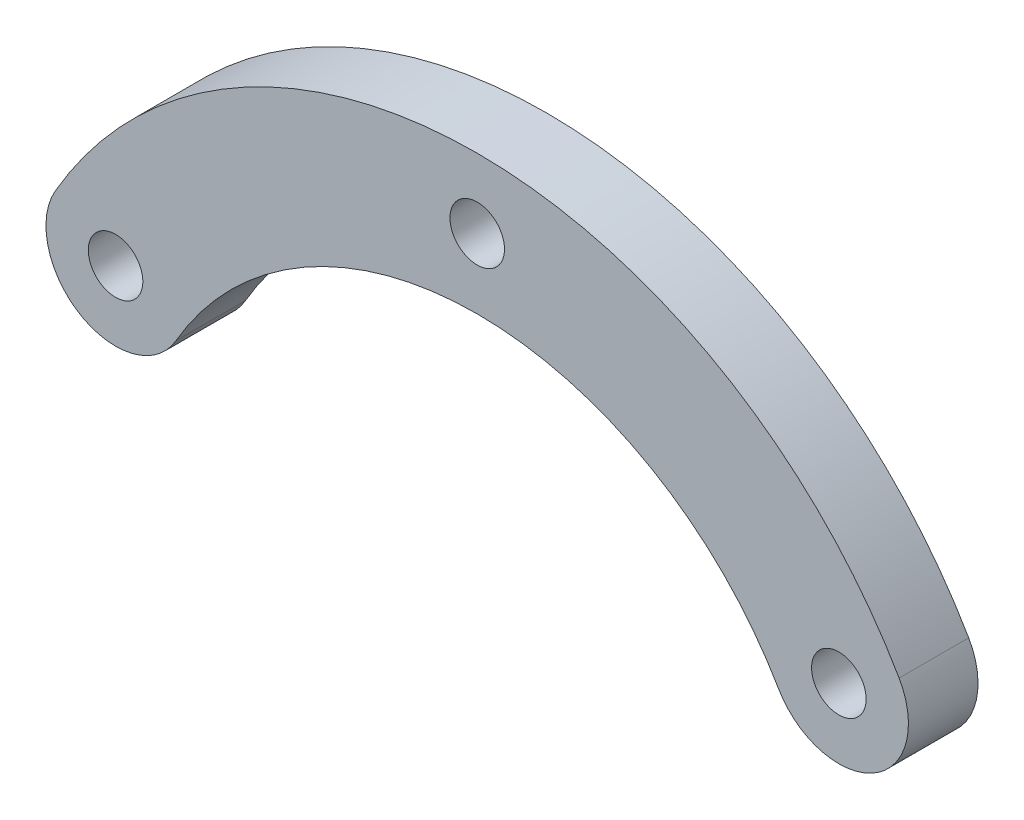
ISO-10303-21;
HEADER;
FILE_DESCRIPTION(('STEP AP214'),'2;1');
FILE_NAME('part.step','',(''),(''),'','','');
FILE_SCHEMA(('AUTOMOTIVE_DESIGN { 1 0 10303 214 1 1 1 1 }'));
ENDSEC;
DATA;
#1=APPLICATION_CONTEXT('core data for automotive mechanical design processes');
#2=APPLICATION_PROTOCOL_DEFINITION('international standard','automotive_design',2000,#1);
#3=PRODUCT_CONTEXT('',#1,'mechanical');
#4=PRODUCT('Part','Part','',(#3));
#5=PRODUCT_RELATED_PRODUCT_CATEGORY('part','',(#4));
#6=PRODUCT_DEFINITION_FORMATION('','',#4);
#7=PRODUCT_DEFINITION_CONTEXT('part definition',#1,'design');
#8=PRODUCT_DEFINITION('design','',#6,#7);
#9=PRODUCT_DEFINITION_SHAPE('','',#8);
#10=(LENGTH_UNIT() NAMED_UNIT(*) SI_UNIT(.MILLI.,.METRE.));
#11=(NAMED_UNIT(*) PLANE_ANGLE_UNIT() SI_UNIT($,.RADIAN.));
#12=(NAMED_UNIT(*) SI_UNIT($,.STERADIAN.) SOLID_ANGLE_UNIT());
#13=UNCERTAINTY_MEASURE_WITH_UNIT(LENGTH_MEASURE(1.E-05),#10,'distance_accuracy_value','');
#14=(GEOMETRIC_REPRESENTATION_CONTEXT(3) GLOBAL_UNCERTAINTY_ASSIGNED_CONTEXT((#13)) GLOBAL_UNIT_ASSIGNED_CONTEXT((#10,
#11,#12)) REPRESENTATION_CONTEXT('',''));
#15=CARTESIAN_POINT('',(0.,0.,0.));
#16=DIRECTION('',(0.,0.,1.));
#17=DIRECTION('',(1.,0.,0.));
#18=AXIS2_PLACEMENT_3D('',#15,#16,#17);
#19=CARTESIAN_POINT('',(436.430596881879,220.726,3.175));
#20=DIRECTION('',(0.,0.,-1.));
#21=DIRECTION('',(-1.,0.,0.));
#22=AXIS2_PLACEMENT_3D('',#19,#20,#21);
#23=CYLINDRICAL_SURFACE('',#22,31.75);
#24=CARTESIAN_POINT('',(436.430596881879,220.726,3.175));
#25=DIRECTION('',(0.,0.,1.));
#26=DIRECTION('',(1.,0.,0.));
#27=AXIS2_PLACEMENT_3D('',#24,#25,#26);
#28=CIRCLE('',#27,31.75);
#29=CARTESIAN_POINT('',(463.926903452035,236.601,3.175));
#30=VERTEX_POINT('',#29);
#31=CARTESIAN_POINT('',(408.934290311723,236.601,3.175));
#32=VERTEX_POINT('',#31);
#33=EDGE_CURVE('E152',#30,#32,#28,.T.);
#34=ORIENTED_EDGE('',*,*,#33,.T.);
#35=DIRECTION('',(0.,0.,-1.));
#36=VECTOR('',#35,1.);
#37=CARTESIAN_POINT('',(408.934290311723,236.601,3.175));
#38=LINE('',#37,#36);
#39=CARTESIAN_POINT('',(408.934290311723,236.601,-3.175));
#40=VERTEX_POINT('',#39);
#41=EDGE_CURVE('E114',#32,#40,#38,.T.);
#42=ORIENTED_EDGE('',*,*,#41,.T.);
#43=CARTESIAN_POINT('',(436.430596881879,220.726,-3.175));
#44=DIRECTION('',(0.,0.,1.));
#45=DIRECTION('',(1.,0.,0.));
#46=AXIS2_PLACEMENT_3D('',#43,#44,#45);
#47=CIRCLE('',#46,31.75);
#48=CARTESIAN_POINT('',(463.926903452035,236.601,-3.175));
#49=VERTEX_POINT('',#48);
#50=EDGE_CURVE('E100',#49,#40,#47,.T.);
#51=ORIENTED_EDGE('',*,*,#50,.F.);
#52=DIRECTION('',(0.,0.,-1.));
#53=VECTOR('',#52,1.);
#54=CARTESIAN_POINT('',(463.926903452035,236.601,3.175));
#55=LINE('',#54,#53);
#56=EDGE_CURVE('E111',#49,#30,#55,.F.);
#57=ORIENTED_EDGE('',*,*,#56,.T.);
#58=EDGE_LOOP('',(#34,#42,#51,#57));
#59=FACE_BOUND('',#58,.T.);
#60=ADVANCED_FACE('F39',(#59),#23,.F.);
#61=CARTESIAN_POINT('',(436.430596881879,220.726,3.175));
#62=DIRECTION('',(0.,0.,-1.));
#63=DIRECTION('',(-1.,0.,0.));
#64=AXIS2_PLACEMENT_3D('',#61,#62,#63);
#65=CYLINDRICAL_SURFACE('',#64,44.45);
#66=CARTESIAN_POINT('',(436.430596881879,220.726,3.175));
#67=DIRECTION('',(0.,0.,1.));
#68=DIRECTION('',(1.,0.,0.));
#69=AXIS2_PLACEMENT_3D('',#66,#67,#68);
#70=CIRCLE('',#69,44.45);
#71=CARTESIAN_POINT('',(474.925426080097,242.951,3.175));
#72=VERTEX_POINT('',#71);
#73=CARTESIAN_POINT('',(397.935767683661,242.951,3.175));
#74=VERTEX_POINT('',#73);
#75=EDGE_CURVE('E149',#72,#74,#70,.T.);
#76=ORIENTED_EDGE('',*,*,#75,.F.);
#77=DIRECTION('',(0.,0.,-1.));
#78=VECTOR('',#77,1.);
#79=CARTESIAN_POINT('',(474.925426080097,242.951,3.175));
#80=LINE('',#79,#78);
#81=CARTESIAN_POINT('',(474.925426080097,242.951,-3.175));
#82=VERTEX_POINT('',#81);
#83=EDGE_CURVE('E11',#72,#82,#80,.T.);
#84=ORIENTED_EDGE('',*,*,#83,.T.);
#85=CARTESIAN_POINT('',(436.430596881879,220.726,-3.175));
#86=DIRECTION('',(0.,0.,1.));
#87=DIRECTION('',(1.,0.,0.));
#88=AXIS2_PLACEMENT_3D('',#85,#86,#87);
#89=CIRCLE('',#88,44.45);
#90=CARTESIAN_POINT('',(397.935767683661,242.951,-3.175));
#91=VERTEX_POINT('',#90);
#92=EDGE_CURVE('E115',#82,#91,#89,.T.);
#93=ORIENTED_EDGE('',*,*,#92,.T.);
#94=DIRECTION('',(0.,0.,-1.));
#95=VECTOR('',#94,1.);
#96=CARTESIAN_POINT('',(397.935767683661,242.951,3.175));
#97=LINE('',#96,#95);
#98=EDGE_CURVE('E48',#91,#74,#97,.F.);
#99=ORIENTED_EDGE('',*,*,#98,.T.);
#100=EDGE_LOOP('',(#76,#84,#93,#99));
#101=FACE_BOUND('',#100,.T.);
#102=ADVANCED_FACE('F150',(#101),#65,.T.);
#103=CARTESIAN_POINT('',(469.426164766066,239.776,3.175));
#104=DIRECTION('',(0.,0.,-1.));
#105=DIRECTION('',(-1.,0.,0.));
#106=AXIS2_PLACEMENT_3D('',#103,#104,#105);
#107=CYLINDRICAL_SURFACE('',#106,2.48919999999995);
#108=CARTESIAN_POINT('',(469.426164766066,239.776,3.175));
#109=DIRECTION('',(0.,0.,1.));
#110=DIRECTION('',(1.,0.,0.));
#111=AXIS2_PLACEMENT_3D('',#108,#109,#110);
#112=CIRCLE('',#111,2.48919999999995);
#113=CARTESIAN_POINT('',(471.915364766066,239.776,3.175));
#114=VERTEX_POINT('',#113);
#115=EDGE_CURVE('E125',#114,#114,#112,.T.);
#116=ORIENTED_EDGE('',*,*,#115,.T.);
#117=EDGE_LOOP('',(#116));
#118=FACE_BOUND('',#117,.T.);
#119=CARTESIAN_POINT('',(469.426164766066,239.776,-3.175));
#120=DIRECTION('',(0.,0.,1.));
#121=DIRECTION('',(1.,0.,0.));
#122=AXIS2_PLACEMENT_3D('',#119,#120,#121);
#123=CIRCLE('',#122,2.48919999999995);
#124=CARTESIAN_POINT('',(471.915364766066,239.776,-3.175));
#125=VERTEX_POINT('',#124);
#126=EDGE_CURVE('E163',#125,#125,#123,.T.);
#127=ORIENTED_EDGE('',*,*,#126,.F.);
#128=EDGE_LOOP('',(#127));
#129=FACE_BOUND('',#128,.T.);
#130=ADVANCED_FACE('F181',(#118,#129),#107,.F.);
#131=CARTESIAN_POINT('',(436.430596881879,258.826,3.175));
#132=DIRECTION('',(0.,0.,-1.));
#133=DIRECTION('',(-1.,0.,0.));
#134=AXIS2_PLACEMENT_3D('',#131,#132,#133);
#135=CYLINDRICAL_SURFACE('',#134,2.48920000000001);
#136=CARTESIAN_POINT('',(436.430596881879,258.826,3.175));
#137=DIRECTION('',(0.,0.,1.));
#138=DIRECTION('',(1.,0.,0.));
#139=AXIS2_PLACEMENT_3D('',#136,#137,#138);
#140=CIRCLE('',#139,2.48920000000001);
#141=CARTESIAN_POINT('',(438.919796881879,258.826,3.175));
#142=VERTEX_POINT('',#141);
#143=EDGE_CURVE('E151',#142,#142,#140,.T.);
#144=ORIENTED_EDGE('',*,*,#143,.T.);
#145=EDGE_LOOP('',(#144));
#146=FACE_BOUND('',#145,.T.);
#147=CARTESIAN_POINT('',(436.430596881879,258.826,-3.175));
#148=DIRECTION('',(0.,0.,1.));
#149=DIRECTION('',(1.,0.,0.));
#150=AXIS2_PLACEMENT_3D('',#147,#148,#149);
#151=CIRCLE('',#150,2.48920000000001);
#152=CARTESIAN_POINT('',(438.919796881879,258.826,-3.175));
#153=VERTEX_POINT('',#152);
#154=EDGE_CURVE('E161',#153,#153,#151,.T.);
#155=ORIENTED_EDGE('',*,*,#154,.F.);
#156=EDGE_LOOP('',(#155));
#157=FACE_BOUND('',#156,.T.);
#158=ADVANCED_FACE('F173',(#146,#157),#135,.F.);
#159=CARTESIAN_POINT('',(403.435028997692,239.776,3.175));
#160=DIRECTION('',(0.,0.,-1.));
#161=DIRECTION('',(-1.,0.,0.));
#162=AXIS2_PLACEMENT_3D('',#159,#160,#161);
#163=CYLINDRICAL_SURFACE('',#162,2.48920000000001);
#164=CARTESIAN_POINT('',(403.435028997692,239.776,3.175));
#165=DIRECTION('',(0.,0.,1.));
#166=DIRECTION('',(1.,0.,0.));
#167=AXIS2_PLACEMENT_3D('',#164,#165,#166);
#168=CIRCLE('',#167,2.48920000000001);
#169=CARTESIAN_POINT('',(405.924228997692,239.776,3.175));
#170=VERTEX_POINT('',#169);
#171=EDGE_CURVE('E120',#170,#170,#168,.T.);
#172=ORIENTED_EDGE('',*,*,#171,.T.);
#173=EDGE_LOOP('',(#172));
#174=FACE_BOUND('',#173,.T.);
#175=CARTESIAN_POINT('',(403.435028997692,239.776,-3.175));
#176=DIRECTION('',(0.,0.,1.));
#177=DIRECTION('',(1.,0.,0.));
#178=AXIS2_PLACEMENT_3D('',#175,#176,#177);
#179=CIRCLE('',#178,2.48920000000001);
#180=CARTESIAN_POINT('',(405.924228997692,239.776,-3.175));
#181=VERTEX_POINT('',#180);
#182=EDGE_CURVE('E128',#181,#181,#179,.T.);
#183=ORIENTED_EDGE('',*,*,#182,.F.);
#184=EDGE_LOOP('',(#183));
#185=FACE_BOUND('',#184,.T.);
#186=ADVANCED_FACE('F171',(#174,#185),#163,.F.);
#187=CARTESIAN_POINT('',(0.,0.,3.175));
#188=DIRECTION('',(0.,0.,1.));
#189=DIRECTION('',(1.,0.,0.));
#190=AXIS2_PLACEMENT_3D('',#187,#188,#189);
#191=PLANE('',#190);
#192=CARTESIAN_POINT('',(469.426164766066,239.776,3.175));
#193=DIRECTION('',(0.,0.,1.));
#194=DIRECTION('',(1.,0.,0.));
#195=AXIS2_PLACEMENT_3D('',#192,#193,#194);
#196=CIRCLE('',#195,6.35);
#197=CARTESIAN_POINT('',(471.640213432284,233.824488553013,3.175));
#198=VERTEX_POINT('',#197);
#199=EDGE_CURVE('E119',#30,#198,#196,.T.);
#200=ORIENTED_EDGE('',*,*,#199,.T.);
#201=CARTESIAN_POINT('',(469.426164766066,239.776,3.175));
#202=DIRECTION('',(0.,0.,1.));
#203=DIRECTION('',(1.,0.,0.));
#204=AXIS2_PLACEMENT_3D('',#201,#202,#203);
#205=CIRCLE('',#204,6.35);
#206=EDGE_CURVE('E138',#198,#72,#205,.T.);
#207=ORIENTED_EDGE('',*,*,#206,.T.);
#208=ORIENTED_EDGE('',*,*,#75,.T.);
#209=CARTESIAN_POINT('',(403.435028997692,239.776,3.175));
#210=DIRECTION('',(0.,0.,1.));
#211=DIRECTION('',(1.,0.,0.));
#212=AXIS2_PLACEMENT_3D('',#209,#210,#211);
#213=CIRCLE('',#212,6.35);
#214=CARTESIAN_POINT('',(401.220980331474,233.824488553013,3.175));
#215=VERTEX_POINT('',#214);
#216=EDGE_CURVE('E56',#74,#215,#213,.T.);
#217=ORIENTED_EDGE('',*,*,#216,.T.);
#218=CARTESIAN_POINT('',(403.435028997692,239.776,3.175));
#219=DIRECTION('',(0.,0.,1.));
#220=DIRECTION('',(1.,0.,0.));
#221=AXIS2_PLACEMENT_3D('',#218,#219,#220);
#222=CIRCLE('',#221,6.35);
#223=EDGE_CURVE('E135',#215,#32,#222,.T.);
#224=ORIENTED_EDGE('',*,*,#223,.T.);
#225=ORIENTED_EDGE('',*,*,#33,.F.);
#226=EDGE_LOOP('',(#200,#207,#208,#217,#224,#225));
#227=FACE_BOUND('',#226,.T.);
#228=ORIENTED_EDGE('',*,*,#143,.F.);
#229=EDGE_LOOP('',(#228));
#230=FACE_BOUND('',#229,.T.);
#231=ORIENTED_EDGE('',*,*,#115,.F.);
#232=EDGE_LOOP('',(#231));
#233=FACE_BOUND('',#232,.T.);
#234=ORIENTED_EDGE('',*,*,#171,.F.);
#235=EDGE_LOOP('',(#234));
#236=FACE_BOUND('',#235,.T.);
#237=ADVANCED_FACE('F147',(#227,#230,#233,#236),#191,.T.);
#238=CARTESIAN_POINT('',(0.,0.,-3.175));
#239=DIRECTION('',(0.,0.,1.));
#240=DIRECTION('',(1.,0.,0.));
#241=AXIS2_PLACEMENT_3D('',#238,#239,#240);
#242=PLANE('',#241);
#243=ORIENTED_EDGE('',*,*,#92,.F.);
#244=CARTESIAN_POINT('',(469.426164766066,239.776,-3.175));
#245=DIRECTION('',(0.,0.,1.));
#246=DIRECTION('',(1.,0.,0.));
#247=AXIS2_PLACEMENT_3D('',#244,#245,#246);
#248=CIRCLE('',#247,6.35);
#249=CARTESIAN_POINT('',(471.640213432284,233.824488553013,-3.175));
#250=VERTEX_POINT('',#249);
#251=EDGE_CURVE('E101',#82,#250,#248,.F.);
#252=ORIENTED_EDGE('',*,*,#251,.T.);
#253=CARTESIAN_POINT('',(469.426164766066,239.776,-3.175));
#254=DIRECTION('',(0.,0.,1.));
#255=DIRECTION('',(1.,0.,0.));
#256=AXIS2_PLACEMENT_3D('',#253,#254,#255);
#257=CIRCLE('',#256,6.35);
#258=EDGE_CURVE('E95',#250,#49,#257,.F.);
#259=ORIENTED_EDGE('',*,*,#258,.T.);
#260=ORIENTED_EDGE('',*,*,#50,.T.);
#261=CARTESIAN_POINT('',(403.435028997692,239.776,-3.175));
#262=DIRECTION('',(0.,0.,1.));
#263=DIRECTION('',(1.,0.,0.));
#264=AXIS2_PLACEMENT_3D('',#261,#262,#263);
#265=CIRCLE('',#264,6.35);
#266=CARTESIAN_POINT('',(401.220980331474,233.824488553013,-3.175));
#267=VERTEX_POINT('',#266);
#268=EDGE_CURVE('E106',#40,#267,#265,.F.);
#269=ORIENTED_EDGE('',*,*,#268,.T.);
#270=CARTESIAN_POINT('',(403.435028997692,239.776,-3.175));
#271=DIRECTION('',(0.,0.,1.));
#272=DIRECTION('',(1.,0.,0.));
#273=AXIS2_PLACEMENT_3D('',#270,#271,#272);
#274=CIRCLE('',#273,6.35);
#275=EDGE_CURVE('E122',#267,#91,#274,.F.);
#276=ORIENTED_EDGE('',*,*,#275,.T.);
#277=EDGE_LOOP('',(#243,#252,#259,#260,#269,#276));
#278=FACE_BOUND('',#277,.T.);
#279=ORIENTED_EDGE('',*,*,#154,.T.);
#280=EDGE_LOOP('',(#279));
#281=FACE_BOUND('',#280,.T.);
#282=ORIENTED_EDGE('',*,*,#126,.T.);
#283=EDGE_LOOP('',(#282));
#284=FACE_BOUND('',#283,.T.);
#285=ORIENTED_EDGE('',*,*,#182,.T.);
#286=EDGE_LOOP('',(#285));
#287=FACE_BOUND('',#286,.T.);
#288=ADVANCED_FACE('F98',(#278,#281,#284,#287),#242,.F.);
#289=CARTESIAN_POINT('',(403.435028997692,239.776,3.175));
#290=DIRECTION('',(0.,0.,-1.));
#291=DIRECTION('',(-1.,0.,0.));
#292=AXIS2_PLACEMENT_3D('',#289,#290,#291);
#293=CYLINDRICAL_SURFACE('',#292,6.35);
#294=DIRECTION('',(0.,0.,-1.));
#295=VECTOR('',#294,1.);
#296=CARTESIAN_POINT('',(401.220980331474,233.824488553013,3.175));
#297=LINE('',#296,#295);
#298=EDGE_CURVE('E116',#215,#267,#297,.T.);
#299=ORIENTED_EDGE('',*,*,#298,.F.);
#300=ORIENTED_EDGE('',*,*,#216,.F.);
#301=ORIENTED_EDGE('',*,*,#98,.F.);
#302=ORIENTED_EDGE('',*,*,#275,.F.);
#303=EDGE_LOOP('',(#299,#300,#301,#302));
#304=FACE_BOUND('',#303,.T.);
#305=ADVANCED_FACE('F196',(#304),#293,.T.);
#306=CARTESIAN_POINT('',(403.435028997692,239.776,3.175));
#307=DIRECTION('',(0.,0.,-1.));
#308=DIRECTION('',(-1.,0.,0.));
#309=AXIS2_PLACEMENT_3D('',#306,#307,#308);
#310=CYLINDRICAL_SURFACE('',#309,6.35);
#311=ORIENTED_EDGE('',*,*,#223,.F.);
#312=ORIENTED_EDGE('',*,*,#298,.T.);
#313=ORIENTED_EDGE('',*,*,#268,.F.);
#314=ORIENTED_EDGE('',*,*,#41,.F.);
#315=EDGE_LOOP('',(#311,#312,#313,#314));
#316=FACE_BOUND('',#315,.T.);
#317=ADVANCED_FACE('F193',(#316),#310,.T.);
#318=CARTESIAN_POINT('',(469.426164766066,239.776,3.175));
#319=DIRECTION('',(0.,0.,-1.));
#320=DIRECTION('',(-1.,0.,0.));
#321=AXIS2_PLACEMENT_3D('',#318,#319,#320);
#322=CYLINDRICAL_SURFACE('',#321,6.35);
#323=DIRECTION('',(0.,0.,1.));
#324=VECTOR('',#323,1.);
#325=CARTESIAN_POINT('',(471.640213432284,233.824488553013,-3.175));
#326=LINE('',#325,#324);
#327=EDGE_CURVE('E43',#198,#250,#326,.F.);
#328=ORIENTED_EDGE('',*,*,#327,.F.);
#329=ORIENTED_EDGE('',*,*,#199,.F.);
#330=ORIENTED_EDGE('',*,*,#56,.F.);
#331=ORIENTED_EDGE('',*,*,#258,.F.);
#332=EDGE_LOOP('',(#328,#329,#330,#331));
#333=FACE_BOUND('',#332,.T.);
#334=ADVANCED_FACE('F41',(#333),#322,.T.);
#335=CARTESIAN_POINT('',(469.426164766066,239.776,3.175));
#336=DIRECTION('',(0.,0.,-1.));
#337=DIRECTION('',(-1.,0.,0.));
#338=AXIS2_PLACEMENT_3D('',#335,#336,#337);
#339=CYLINDRICAL_SURFACE('',#338,6.35);
#340=ORIENTED_EDGE('',*,*,#206,.F.);
#341=ORIENTED_EDGE('',*,*,#327,.T.);
#342=ORIENTED_EDGE('',*,*,#251,.F.);
#343=ORIENTED_EDGE('',*,*,#83,.F.);
#344=EDGE_LOOP('',(#340,#341,#342,#343));
#345=FACE_BOUND('',#344,.T.);
#346=ADVANCED_FACE('F145',(#345),#339,.T.);
#347=CLOSED_SHELL('',(#60,#102,#130,#158,#186,#237,#288,#305,#317,#334,#346));
#348=MANIFOLD_SOLID_BREP('B2',#347);
#349=ADVANCED_BREP_SHAPE_REPRESENTATION('',(#18,#348),#14);
#350=SHAPE_DEFINITION_REPRESENTATION(#9,#349);
ENDSEC;
END-ISO-10303-21;
